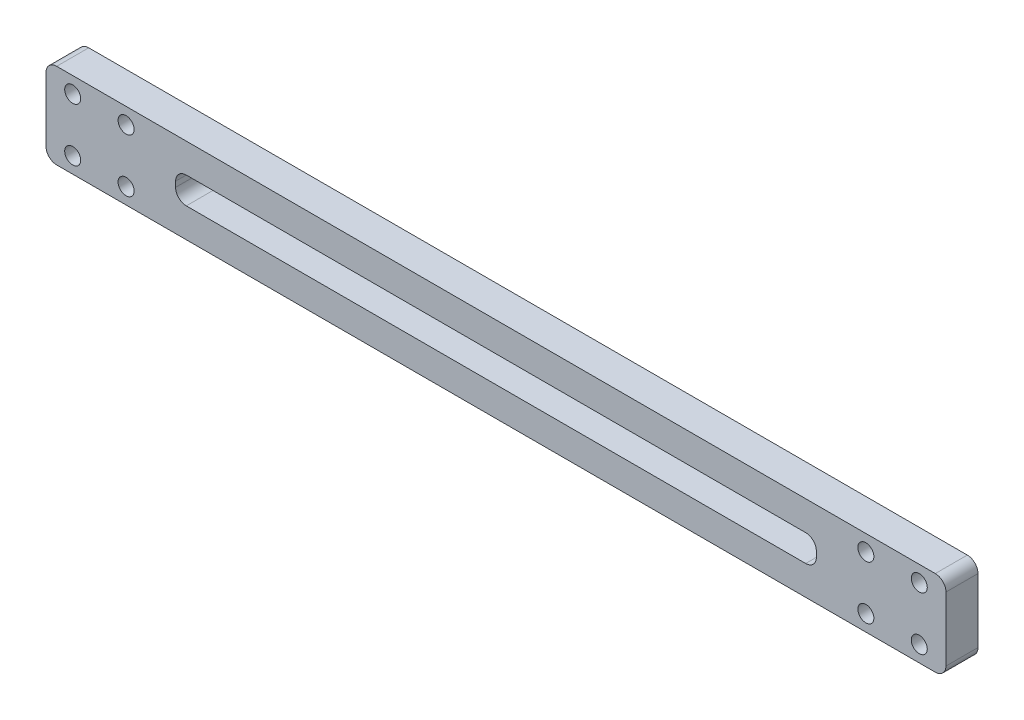
ISO-10303-21;
HEADER;
FILE_DESCRIPTION(('STEP AP214'),'2;1');
FILE_NAME('part.step','',(''),(''),'','','');
FILE_SCHEMA(('AUTOMOTIVE_DESIGN { 1 0 10303 214 1 1 1 1 }'));
ENDSEC;
DATA;
#1=APPLICATION_CONTEXT('core data for automotive mechanical design processes');
#2=APPLICATION_PROTOCOL_DEFINITION('international standard','automotive_design',2000,#1);
#3=PRODUCT_CONTEXT('',#1,'mechanical');
#4=PRODUCT('Part','Part','',(#3));
#5=PRODUCT_RELATED_PRODUCT_CATEGORY('part','',(#4));
#6=PRODUCT_DEFINITION_FORMATION('','',#4);
#7=PRODUCT_DEFINITION_CONTEXT('part definition',#1,'design');
#8=PRODUCT_DEFINITION('design','',#6,#7);
#9=PRODUCT_DEFINITION_SHAPE('','',#8);
#10=(LENGTH_UNIT() NAMED_UNIT(*) SI_UNIT(.MILLI.,.METRE.));
#11=(NAMED_UNIT(*) PLANE_ANGLE_UNIT() SI_UNIT($,.RADIAN.));
#12=(NAMED_UNIT(*) SI_UNIT($,.STERADIAN.) SOLID_ANGLE_UNIT());
#13=UNCERTAINTY_MEASURE_WITH_UNIT(LENGTH_MEASURE(1.E-05),#10,'distance_accuracy_value','');
#14=(GEOMETRIC_REPRESENTATION_CONTEXT(3) GLOBAL_UNCERTAINTY_ASSIGNED_CONTEXT((#13)) GLOBAL_UNIT_ASSIGNED_CONTEXT((#10,
#11,#12)) REPRESENTATION_CONTEXT('',''));
#15=CARTESIAN_POINT('',(0.,0.,0.));
#16=DIRECTION('',(0.,0.,1.));
#17=DIRECTION('',(1.,0.,0.));
#18=AXIS2_PLACEMENT_3D('',#15,#16,#17);
#19=CARTESIAN_POINT('',(0.,0.,6.));
#20=DIRECTION('',(0.,0.,-1.));
#21=DIRECTION('',(-1.,0.,0.));
#22=AXIS2_PLACEMENT_3D('',#19,#20,#21);
#23=PLANE('',#22);
#24=DIRECTION('',(-1.,0.,0.));
#25=VECTOR('',#24,1.);
#26=CARTESIAN_POINT('',(-60.,2.5,6.));
#27=LINE('',#26,#25);
#28=CARTESIAN_POINT('',(58.,2.5,6.));
#29=VERTEX_POINT('',#28);
#30=CARTESIAN_POINT('',(-58.,2.5,6.));
#31=VERTEX_POINT('',#30);
#32=EDGE_CURVE('E261',#29,#31,#27,.T.);
#33=ORIENTED_EDGE('',*,*,#32,.F.);
#34=CARTESIAN_POINT('',(58.,0.5,6.));
#35=DIRECTION('',(0.,0.,-1.));
#36=DIRECTION('',(-1.,0.,0.));
#37=AXIS2_PLACEMENT_3D('',#34,#35,#36);
#38=CIRCLE('',#37,2.);
#39=CARTESIAN_POINT('',(60.,0.5,6.));
#40=VERTEX_POINT('',#39);
#41=EDGE_CURVE('E255',#29,#40,#38,.T.);
#42=ORIENTED_EDGE('',*,*,#41,.T.);
#43=DIRECTION('',(0.,1.,0.));
#44=VECTOR('',#43,1.);
#45=CARTESIAN_POINT('',(60.,-2.5,6.));
#46=LINE('',#45,#44);
#47=CARTESIAN_POINT('',(60.,-0.5,6.));
#48=VERTEX_POINT('',#47);
#49=EDGE_CURVE('E268',#48,#40,#46,.T.);
#50=ORIENTED_EDGE('',*,*,#49,.F.);
#51=CARTESIAN_POINT('',(58.,-0.5,6.));
#52=DIRECTION('',(0.,0.,-1.));
#53=DIRECTION('',(-1.,0.,0.));
#54=AXIS2_PLACEMENT_3D('',#51,#52,#53);
#55=CIRCLE('',#54,2.);
#56=CARTESIAN_POINT('',(58.,-2.5,6.));
#57=VERTEX_POINT('',#56);
#58=EDGE_CURVE('E247',#48,#57,#55,.T.);
#59=ORIENTED_EDGE('',*,*,#58,.T.);
#60=DIRECTION('',(1.,0.,0.));
#61=VECTOR('',#60,1.);
#62=CARTESIAN_POINT('',(-60.,-2.5,6.));
#63=LINE('',#62,#61);
#64=CARTESIAN_POINT('',(-58.,-2.5,6.));
#65=VERTEX_POINT('',#64);
#66=EDGE_CURVE('E292',#65,#57,#63,.T.);
#67=ORIENTED_EDGE('',*,*,#66,.F.);
#68=CARTESIAN_POINT('',(-58.,-0.5,6.));
#69=DIRECTION('',(0.,0.,-1.));
#70=DIRECTION('',(-1.,0.,0.));
#71=AXIS2_PLACEMENT_3D('',#68,#69,#70);
#72=CIRCLE('',#71,2.);
#73=CARTESIAN_POINT('',(-60.,-0.5,6.));
#74=VERTEX_POINT('',#73);
#75=EDGE_CURVE('E251',#65,#74,#72,.T.);
#76=ORIENTED_EDGE('',*,*,#75,.T.);
#77=DIRECTION('',(0.,-1.,0.));
#78=VECTOR('',#77,1.);
#79=CARTESIAN_POINT('',(-60.,-2.5,6.));
#80=LINE('',#79,#78);
#81=CARTESIAN_POINT('',(-60.,0.5,6.));
#82=VERTEX_POINT('',#81);
#83=EDGE_CURVE('E263',#82,#74,#80,.T.);
#84=ORIENTED_EDGE('',*,*,#83,.F.);
#85=CARTESIAN_POINT('',(-58.,0.5,6.));
#86=DIRECTION('',(0.,0.,-1.));
#87=DIRECTION('',(-1.,0.,0.));
#88=AXIS2_PLACEMENT_3D('',#85,#86,#87);
#89=CIRCLE('',#88,2.);
#90=EDGE_CURVE('E52',#82,#31,#89,.T.);
#91=ORIENTED_EDGE('',*,*,#90,.T.);
#92=EDGE_LOOP('',(#33,#42,#50,#59,#67,#76,#84,#91));
#93=FACE_BOUND('',#92,.T.);
#94=DIRECTION('',(1.,0.,0.));
#95=VECTOR('',#94,1.);
#96=CARTESIAN_POINT('',(-84.27,-8.,6.));
#97=LINE('',#96,#95);
#98=CARTESIAN_POINT('',(-82.27,-8.,6.));
#99=VERTEX_POINT('',#98);
#100=CARTESIAN_POINT('',(82.27,-8.,6.));
#101=VERTEX_POINT('',#100);
#102=EDGE_CURVE('E195',#99,#101,#97,.T.);
#103=ORIENTED_EDGE('',*,*,#102,.T.);
#104=CARTESIAN_POINT('',(82.27,-6.,6.));
#105=DIRECTION('',(0.,0.,-1.));
#106=DIRECTION('',(-1.,0.,0.));
#107=AXIS2_PLACEMENT_3D('',#104,#105,#106);
#108=CIRCLE('',#107,2.);
#109=CARTESIAN_POINT('',(84.27,-6.,6.));
#110=VERTEX_POINT('',#109);
#111=EDGE_CURVE('E216',#101,#110,#108,.F.);
#112=ORIENTED_EDGE('',*,*,#111,.T.);
#113=DIRECTION('',(0.,1.,0.));
#114=VECTOR('',#113,1.);
#115=CARTESIAN_POINT('',(84.27,-8.,6.));
#116=LINE('',#115,#114);
#117=CARTESIAN_POINT('',(84.27,6.,6.));
#118=VERTEX_POINT('',#117);
#119=EDGE_CURVE('E178',#110,#118,#116,.T.);
#120=ORIENTED_EDGE('',*,*,#119,.T.);
#121=CARTESIAN_POINT('',(82.27,6.,6.));
#122=DIRECTION('',(0.,0.,-1.));
#123=DIRECTION('',(-1.,0.,0.));
#124=AXIS2_PLACEMENT_3D('',#121,#122,#123);
#125=CIRCLE('',#124,2.);
#126=CARTESIAN_POINT('',(82.27,8.,6.));
#127=VERTEX_POINT('',#126);
#128=EDGE_CURVE('E210',#118,#127,#125,.F.);
#129=ORIENTED_EDGE('',*,*,#128,.T.);
#130=DIRECTION('',(-1.,0.,0.));
#131=VECTOR('',#130,1.);
#132=CARTESIAN_POINT('',(-84.27,8.,6.));
#133=LINE('',#132,#131);
#134=CARTESIAN_POINT('',(-82.27,8.,6.));
#135=VERTEX_POINT('',#134);
#136=EDGE_CURVE('E339',#127,#135,#133,.T.);
#137=ORIENTED_EDGE('',*,*,#136,.T.);
#138=CARTESIAN_POINT('',(-82.27,6.,6.));
#139=DIRECTION('',(0.,0.,-1.));
#140=DIRECTION('',(-1.,0.,0.));
#141=AXIS2_PLACEMENT_3D('',#138,#139,#140);
#142=CIRCLE('',#141,2.);
#143=CARTESIAN_POINT('',(-84.27,6.,6.));
#144=VERTEX_POINT('',#143);
#145=EDGE_CURVE('E212',#135,#144,#142,.F.);
#146=ORIENTED_EDGE('',*,*,#145,.T.);
#147=DIRECTION('',(0.,-1.,0.));
#148=VECTOR('',#147,1.);
#149=CARTESIAN_POINT('',(-84.27,-8.,6.));
#150=LINE('',#149,#148);
#151=CARTESIAN_POINT('',(-84.27,-6.,6.));
#152=VERTEX_POINT('',#151);
#153=EDGE_CURVE('E341',#144,#152,#150,.T.);
#154=ORIENTED_EDGE('',*,*,#153,.T.);
#155=CARTESIAN_POINT('',(-82.27,-6.,6.));
#156=DIRECTION('',(0.,0.,-1.));
#157=DIRECTION('',(-1.,0.,0.));
#158=AXIS2_PLACEMENT_3D('',#155,#156,#157);
#159=CIRCLE('',#158,2.);
#160=EDGE_CURVE('E214',#152,#99,#159,.F.);
#161=ORIENTED_EDGE('',*,*,#160,.T.);
#162=EDGE_LOOP('',(#103,#112,#120,#129,#137,#146,#154,#161));
#163=FACE_BOUND('',#162,.T.);
#164=CARTESIAN_POINT('',(69.27,5.,6.));
#165=DIRECTION('',(0.,0.,1.));
#166=DIRECTION('',(1.,0.,0.));
#167=AXIS2_PLACEMENT_3D('',#164,#165,#166);
#168=CIRCLE('',#167,1.5);
#169=CARTESIAN_POINT('',(70.77,5.,6.));
#170=VERTEX_POINT('',#169);
#171=EDGE_CURVE('E186',#170,#170,#168,.T.);
#172=ORIENTED_EDGE('',*,*,#171,.F.);
#173=EDGE_LOOP('',(#172));
#174=FACE_BOUND('',#173,.T.);
#175=CARTESIAN_POINT('',(79.27,5.,6.));
#176=DIRECTION('',(0.,0.,1.));
#177=DIRECTION('',(1.,0.,0.));
#178=AXIS2_PLACEMENT_3D('',#175,#176,#177);
#179=CIRCLE('',#178,1.5);
#180=CARTESIAN_POINT('',(80.77,5.,6.));
#181=VERTEX_POINT('',#180);
#182=EDGE_CURVE('E331',#181,#181,#179,.T.);
#183=ORIENTED_EDGE('',*,*,#182,.F.);
#184=EDGE_LOOP('',(#183));
#185=FACE_BOUND('',#184,.T.);
#186=CARTESIAN_POINT('',(69.27,-5.,6.));
#187=DIRECTION('',(0.,0.,1.));
#188=DIRECTION('',(1.,0.,0.));
#189=AXIS2_PLACEMENT_3D('',#186,#187,#188);
#190=CIRCLE('',#189,1.5);
#191=CARTESIAN_POINT('',(70.77,-5.,6.));
#192=VERTEX_POINT('',#191);
#193=EDGE_CURVE('E325',#192,#192,#190,.T.);
#194=ORIENTED_EDGE('',*,*,#193,.F.);
#195=EDGE_LOOP('',(#194));
#196=FACE_BOUND('',#195,.T.);
#197=CARTESIAN_POINT('',(79.27,-5.,6.));
#198=DIRECTION('',(0.,0.,1.));
#199=DIRECTION('',(1.,0.,0.));
#200=AXIS2_PLACEMENT_3D('',#197,#198,#199);
#201=CIRCLE('',#200,1.5);
#202=CARTESIAN_POINT('',(80.77,-5.,6.));
#203=VERTEX_POINT('',#202);
#204=EDGE_CURVE('E319',#203,#203,#201,.T.);
#205=ORIENTED_EDGE('',*,*,#204,.F.);
#206=EDGE_LOOP('',(#205));
#207=FACE_BOUND('',#206,.T.);
#208=CARTESIAN_POINT('',(-79.27,-5.,6.));
#209=DIRECTION('',(0.,0.,1.));
#210=DIRECTION('',(-1.,0.,0.));
#211=AXIS2_PLACEMENT_3D('',#208,#209,#210);
#212=CIRCLE('',#211,1.5);
#213=CARTESIAN_POINT('',(-80.77,-5.,6.));
#214=VERTEX_POINT('',#213);
#215=EDGE_CURVE('E313',#214,#214,#212,.T.);
#216=ORIENTED_EDGE('',*,*,#215,.F.);
#217=EDGE_LOOP('',(#216));
#218=FACE_BOUND('',#217,.T.);
#219=CARTESIAN_POINT('',(-69.27,-5.,6.));
#220=DIRECTION('',(0.,0.,1.));
#221=DIRECTION('',(-1.,0.,0.));
#222=AXIS2_PLACEMENT_3D('',#219,#220,#221);
#223=CIRCLE('',#222,1.5);
#224=CARTESIAN_POINT('',(-70.77,-5.,6.));
#225=VERTEX_POINT('',#224);
#226=EDGE_CURVE('E307',#225,#225,#223,.T.);
#227=ORIENTED_EDGE('',*,*,#226,.F.);
#228=EDGE_LOOP('',(#227));
#229=FACE_BOUND('',#228,.T.);
#230=CARTESIAN_POINT('',(-69.27,5.,6.));
#231=DIRECTION('',(0.,0.,1.));
#232=DIRECTION('',(-1.,0.,0.));
#233=AXIS2_PLACEMENT_3D('',#230,#231,#232);
#234=CIRCLE('',#233,1.5);
#235=CARTESIAN_POINT('',(-70.77,5.,6.));
#236=VERTEX_POINT('',#235);
#237=EDGE_CURVE('E301',#236,#236,#234,.T.);
#238=ORIENTED_EDGE('',*,*,#237,.F.);
#239=EDGE_LOOP('',(#238));
#240=FACE_BOUND('',#239,.T.);
#241=CARTESIAN_POINT('',(-79.27,5.,6.));
#242=DIRECTION('',(0.,0.,1.));
#243=DIRECTION('',(-1.,0.,0.));
#244=AXIS2_PLACEMENT_3D('',#241,#242,#243);
#245=CIRCLE('',#244,1.5);
#246=CARTESIAN_POINT('',(-80.77,5.,6.));
#247=VERTEX_POINT('',#246);
#248=EDGE_CURVE('E295',#247,#247,#245,.T.);
#249=ORIENTED_EDGE('',*,*,#248,.F.);
#250=EDGE_LOOP('',(#249));
#251=FACE_BOUND('',#250,.T.);
#252=ADVANCED_FACE('F44',(#93,#163,#174,#185,#196,#207,#218,#229,#240,#251),#23,.F.);
#253=CARTESIAN_POINT('',(0.,0.,0.));
#254=DIRECTION('',(0.,0.,-1.));
#255=DIRECTION('',(-1.,0.,0.));
#256=AXIS2_PLACEMENT_3D('',#253,#254,#255);
#257=PLANE('',#256);
#258=DIRECTION('',(1.,0.,0.));
#259=VECTOR('',#258,1.);
#260=CARTESIAN_POINT('',(-60.,-2.5,0.));
#261=LINE('',#260,#259);
#262=CARTESIAN_POINT('',(-58.,-2.5,0.));
#263=VERTEX_POINT('',#262);
#264=CARTESIAN_POINT('',(58.,-2.5,0.));
#265=VERTEX_POINT('',#264);
#266=EDGE_CURVE('E281',#263,#265,#261,.T.);
#267=ORIENTED_EDGE('',*,*,#266,.T.);
#268=CARTESIAN_POINT('',(58.,-0.5,0.));
#269=DIRECTION('',(0.,0.,-1.));
#270=DIRECTION('',(-1.,0.,0.));
#271=AXIS2_PLACEMENT_3D('',#268,#269,#270);
#272=CIRCLE('',#271,2.);
#273=CARTESIAN_POINT('',(60.,-0.5,0.));
#274=VERTEX_POINT('',#273);
#275=EDGE_CURVE('E249',#265,#274,#272,.F.);
#276=ORIENTED_EDGE('',*,*,#275,.T.);
#277=DIRECTION('',(0.,1.,0.));
#278=VECTOR('',#277,1.);
#279=CARTESIAN_POINT('',(60.,-2.5,0.));
#280=LINE('',#279,#278);
#281=CARTESIAN_POINT('',(60.,0.5,0.));
#282=VERTEX_POINT('',#281);
#283=EDGE_CURVE('E285',#274,#282,#280,.T.);
#284=ORIENTED_EDGE('',*,*,#283,.T.);
#285=CARTESIAN_POINT('',(58.,0.5,0.));
#286=DIRECTION('',(0.,0.,-1.));
#287=DIRECTION('',(-1.,0.,0.));
#288=AXIS2_PLACEMENT_3D('',#285,#286,#287);
#289=CIRCLE('',#288,2.);
#290=CARTESIAN_POINT('',(58.,2.5,0.));
#291=VERTEX_POINT('',#290);
#292=EDGE_CURVE('E66',#282,#291,#289,.F.);
#293=ORIENTED_EDGE('',*,*,#292,.T.);
#294=DIRECTION('',(-1.,0.,0.));
#295=VECTOR('',#294,1.);
#296=CARTESIAN_POINT('',(-60.,2.5,0.));
#297=LINE('',#296,#295);
#298=CARTESIAN_POINT('',(-58.,2.5,0.));
#299=VERTEX_POINT('',#298);
#300=EDGE_CURVE('E277',#291,#299,#297,.T.);
#301=ORIENTED_EDGE('',*,*,#300,.T.);
#302=CARTESIAN_POINT('',(-58.,0.5,0.));
#303=DIRECTION('',(0.,0.,-1.));
#304=DIRECTION('',(-1.,0.,0.));
#305=AXIS2_PLACEMENT_3D('',#302,#303,#304);
#306=CIRCLE('',#305,2.);
#307=CARTESIAN_POINT('',(-60.,0.5,0.));
#308=VERTEX_POINT('',#307);
#309=EDGE_CURVE('E11',#299,#308,#306,.F.);
#310=ORIENTED_EDGE('',*,*,#309,.T.);
#311=DIRECTION('',(0.,-1.,0.));
#312=VECTOR('',#311,1.);
#313=CARTESIAN_POINT('',(-60.,-2.5,0.));
#314=LINE('',#313,#312);
#315=CARTESIAN_POINT('',(-60.,-0.5,0.));
#316=VERTEX_POINT('',#315);
#317=EDGE_CURVE('E275',#308,#316,#314,.T.);
#318=ORIENTED_EDGE('',*,*,#317,.T.);
#319=CARTESIAN_POINT('',(-58.,-0.5,0.));
#320=DIRECTION('',(0.,0.,-1.));
#321=DIRECTION('',(-1.,0.,0.));
#322=AXIS2_PLACEMENT_3D('',#319,#320,#321);
#323=CIRCLE('',#322,2.);
#324=EDGE_CURVE('E253',#316,#263,#323,.F.);
#325=ORIENTED_EDGE('',*,*,#324,.T.);
#326=EDGE_LOOP('',(#267,#276,#284,#293,#301,#310,#318,#325));
#327=FACE_BOUND('',#326,.T.);
#328=CARTESIAN_POINT('',(-69.27,5.,0.));
#329=DIRECTION('',(0.,0.,1.));
#330=DIRECTION('',(-1.,0.,0.));
#331=AXIS2_PLACEMENT_3D('',#328,#329,#330);
#332=CIRCLE('',#331,1.5);
#333=CARTESIAN_POINT('',(-70.77,5.,0.));
#334=VERTEX_POINT('',#333);
#335=EDGE_CURVE('E298',#334,#334,#332,.T.);
#336=ORIENTED_EDGE('',*,*,#335,.T.);
#337=EDGE_LOOP('',(#336));
#338=FACE_BOUND('',#337,.T.);
#339=CARTESIAN_POINT('',(-79.27,-5.,0.));
#340=DIRECTION('',(0.,0.,1.));
#341=DIRECTION('',(-1.,0.,0.));
#342=AXIS2_PLACEMENT_3D('',#339,#340,#341);
#343=CIRCLE('',#342,1.5);
#344=CARTESIAN_POINT('',(-80.77,-5.,0.));
#345=VERTEX_POINT('',#344);
#346=EDGE_CURVE('E310',#345,#345,#343,.T.);
#347=ORIENTED_EDGE('',*,*,#346,.T.);
#348=EDGE_LOOP('',(#347));
#349=FACE_BOUND('',#348,.T.);
#350=CARTESIAN_POINT('',(69.27,-5.,0.));
#351=DIRECTION('',(0.,0.,1.));
#352=DIRECTION('',(1.,0.,0.));
#353=AXIS2_PLACEMENT_3D('',#350,#351,#352);
#354=CIRCLE('',#353,1.5);
#355=CARTESIAN_POINT('',(70.77,-5.,0.));
#356=VERTEX_POINT('',#355);
#357=EDGE_CURVE('E322',#356,#356,#354,.T.);
#358=ORIENTED_EDGE('',*,*,#357,.T.);
#359=EDGE_LOOP('',(#358));
#360=FACE_BOUND('',#359,.T.);
#361=CARTESIAN_POINT('',(69.27,5.,0.));
#362=DIRECTION('',(0.,0.,1.));
#363=DIRECTION('',(1.,0.,0.));
#364=AXIS2_PLACEMENT_3D('',#361,#362,#363);
#365=CIRCLE('',#364,1.5);
#366=CARTESIAN_POINT('',(70.77,5.,0.));
#367=VERTEX_POINT('',#366);
#368=EDGE_CURVE('E192',#367,#367,#365,.T.);
#369=ORIENTED_EDGE('',*,*,#368,.T.);
#370=EDGE_LOOP('',(#369));
#371=FACE_BOUND('',#370,.T.);
#372=DIRECTION('',(0.,1.,0.));
#373=VECTOR('',#372,1.);
#374=CARTESIAN_POINT('',(84.27,-8.,0.));
#375=LINE('',#374,#373);
#376=CARTESIAN_POINT('',(84.27,-6.,0.));
#377=VERTEX_POINT('',#376);
#378=CARTESIAN_POINT('',(84.27,6.,0.));
#379=VERTEX_POINT('',#378);
#380=EDGE_CURVE('E175',#377,#379,#375,.T.);
#381=ORIENTED_EDGE('',*,*,#380,.F.);
#382=CARTESIAN_POINT('',(82.27,-6.,0.));
#383=DIRECTION('',(0.,0.,-1.));
#384=DIRECTION('',(-1.,0.,0.));
#385=AXIS2_PLACEMENT_3D('',#382,#383,#384);
#386=CIRCLE('',#385,2.);
#387=CARTESIAN_POINT('',(82.27,-8.,0.));
#388=VERTEX_POINT('',#387);
#389=EDGE_CURVE('E158',#377,#388,#386,.T.);
#390=ORIENTED_EDGE('',*,*,#389,.T.);
#391=DIRECTION('',(1.,0.,0.));
#392=VECTOR('',#391,1.);
#393=CARTESIAN_POINT('',(-84.27,-8.,0.));
#394=LINE('',#393,#392);
#395=CARTESIAN_POINT('',(-82.27,-8.,0.));
#396=VERTEX_POINT('',#395);
#397=EDGE_CURVE('E200',#396,#388,#394,.T.);
#398=ORIENTED_EDGE('',*,*,#397,.F.);
#399=CARTESIAN_POINT('',(-82.27,-6.,0.));
#400=DIRECTION('',(0.,0.,-1.));
#401=DIRECTION('',(-1.,0.,0.));
#402=AXIS2_PLACEMENT_3D('',#399,#400,#401);
#403=CIRCLE('',#402,2.);
#404=CARTESIAN_POINT('',(-84.27,-6.,0.));
#405=VERTEX_POINT('',#404);
#406=EDGE_CURVE('E169',#396,#405,#403,.T.);
#407=ORIENTED_EDGE('',*,*,#406,.T.);
#408=DIRECTION('',(0.,-1.,0.));
#409=VECTOR('',#408,1.);
#410=CARTESIAN_POINT('',(-84.27,-8.,0.));
#411=LINE('',#410,#409);
#412=CARTESIAN_POINT('',(-84.27,6.,0.));
#413=VERTEX_POINT('',#412);
#414=EDGE_CURVE('E189',#413,#405,#411,.T.);
#415=ORIENTED_EDGE('',*,*,#414,.F.);
#416=CARTESIAN_POINT('',(-82.27,6.,0.));
#417=DIRECTION('',(0.,0.,-1.));
#418=DIRECTION('',(-1.,0.,0.));
#419=AXIS2_PLACEMENT_3D('',#416,#417,#418);
#420=CIRCLE('',#419,2.);
#421=CARTESIAN_POINT('',(-82.27,8.,0.));
#422=VERTEX_POINT('',#421);
#423=EDGE_CURVE('E204',#413,#422,#420,.T.);
#424=ORIENTED_EDGE('',*,*,#423,.T.);
#425=DIRECTION('',(-1.,0.,0.));
#426=VECTOR('',#425,1.);
#427=CARTESIAN_POINT('',(-84.27,8.,0.));
#428=LINE('',#427,#426);
#429=CARTESIAN_POINT('',(82.27,8.,0.));
#430=VERTEX_POINT('',#429);
#431=EDGE_CURVE('E185',#430,#422,#428,.T.);
#432=ORIENTED_EDGE('',*,*,#431,.F.);
#433=CARTESIAN_POINT('',(82.27,6.,0.));
#434=DIRECTION('',(0.,0.,-1.));
#435=DIRECTION('',(-1.,0.,0.));
#436=AXIS2_PLACEMENT_3D('',#433,#434,#435);
#437=CIRCLE('',#436,2.);
#438=EDGE_CURVE('E179',#430,#379,#437,.T.);
#439=ORIENTED_EDGE('',*,*,#438,.T.);
#440=EDGE_LOOP('',(#381,#390,#398,#407,#415,#424,#432,#439));
#441=FACE_BOUND('',#440,.T.);
#442=CARTESIAN_POINT('',(79.27,5.,0.));
#443=DIRECTION('',(0.,0.,1.));
#444=DIRECTION('',(1.,0.,0.));
#445=AXIS2_PLACEMENT_3D('',#442,#443,#444);
#446=CIRCLE('',#445,1.5);
#447=CARTESIAN_POINT('',(80.77,5.,0.));
#448=VERTEX_POINT('',#447);
#449=EDGE_CURVE('E328',#448,#448,#446,.T.);
#450=ORIENTED_EDGE('',*,*,#449,.T.);
#451=EDGE_LOOP('',(#450));
#452=FACE_BOUND('',#451,.T.);
#453=CARTESIAN_POINT('',(79.27,-5.,0.));
#454=DIRECTION('',(0.,0.,1.));
#455=DIRECTION('',(1.,0.,0.));
#456=AXIS2_PLACEMENT_3D('',#453,#454,#455);
#457=CIRCLE('',#456,1.5);
#458=CARTESIAN_POINT('',(80.77,-5.,0.));
#459=VERTEX_POINT('',#458);
#460=EDGE_CURVE('E316',#459,#459,#457,.T.);
#461=ORIENTED_EDGE('',*,*,#460,.T.);
#462=EDGE_LOOP('',(#461));
#463=FACE_BOUND('',#462,.T.);
#464=CARTESIAN_POINT('',(-69.27,-5.,0.));
#465=DIRECTION('',(0.,0.,1.));
#466=DIRECTION('',(-1.,0.,0.));
#467=AXIS2_PLACEMENT_3D('',#464,#465,#466);
#468=CIRCLE('',#467,1.5);
#469=CARTESIAN_POINT('',(-70.77,-5.,0.));
#470=VERTEX_POINT('',#469);
#471=EDGE_CURVE('E304',#470,#470,#468,.T.);
#472=ORIENTED_EDGE('',*,*,#471,.T.);
#473=EDGE_LOOP('',(#472));
#474=FACE_BOUND('',#473,.T.);
#475=CARTESIAN_POINT('',(-79.27,5.,0.));
#476=DIRECTION('',(0.,0.,1.));
#477=DIRECTION('',(-1.,0.,0.));
#478=AXIS2_PLACEMENT_3D('',#475,#476,#477);
#479=CIRCLE('',#478,1.5);
#480=CARTESIAN_POINT('',(-80.77,5.,0.));
#481=VERTEX_POINT('',#480);
#482=EDGE_CURVE('E283',#481,#481,#479,.T.);
#483=ORIENTED_EDGE('',*,*,#482,.T.);
#484=EDGE_LOOP('',(#483));
#485=FACE_BOUND('',#484,.T.);
#486=ADVANCED_FACE('F182',(#327,#338,#349,#360,#371,#441,#452,#463,#474,#485),#257,.T.);
#487=CARTESIAN_POINT('',(84.27,-8.,6.));
#488=DIRECTION('',(-1.,0.,0.));
#489=DIRECTION('',(0.,0.,1.));
#490=AXIS2_PLACEMENT_3D('',#487,#488,#489);
#491=PLANE('',#490);
#492=ORIENTED_EDGE('',*,*,#119,.F.);
#493=DIRECTION('',(0.,0.,-1.));
#494=VECTOR('',#493,1.);
#495=CARTESIAN_POINT('',(84.27,-6.,6.));
#496=LINE('',#495,#494);
#497=EDGE_CURVE('E162',#110,#377,#496,.T.);
#498=ORIENTED_EDGE('',*,*,#497,.T.);
#499=ORIENTED_EDGE('',*,*,#380,.T.);
#500=DIRECTION('',(0.,0.,-1.));
#501=VECTOR('',#500,1.);
#502=CARTESIAN_POINT('',(84.27,6.,6.));
#503=LINE('',#502,#501);
#504=EDGE_CURVE('E180',#379,#118,#503,.F.);
#505=ORIENTED_EDGE('',*,*,#504,.T.);
#506=EDGE_LOOP('',(#492,#498,#499,#505));
#507=FACE_BOUND('',#506,.T.);
#508=ADVANCED_FACE('F174',(#507),#491,.F.);
#509=CARTESIAN_POINT('',(-84.27,8.,6.));
#510=DIRECTION('',(0.,-1.,0.));
#511=DIRECTION('',(0.,0.,-1.));
#512=AXIS2_PLACEMENT_3D('',#509,#510,#511);
#513=PLANE('',#512);
#514=ORIENTED_EDGE('',*,*,#431,.T.);
#515=DIRECTION('',(0.,0.,-1.));
#516=VECTOR('',#515,1.);
#517=CARTESIAN_POINT('',(-82.27,8.,6.));
#518=LINE('',#517,#516);
#519=EDGE_CURVE('E226',#422,#135,#518,.F.);
#520=ORIENTED_EDGE('',*,*,#519,.T.);
#521=ORIENTED_EDGE('',*,*,#136,.F.);
#522=DIRECTION('',(0.,0.,-1.));
#523=VECTOR('',#522,1.);
#524=CARTESIAN_POINT('',(82.27,8.,6.));
#525=LINE('',#524,#523);
#526=EDGE_CURVE('E223',#127,#430,#525,.T.);
#527=ORIENTED_EDGE('',*,*,#526,.T.);
#528=EDGE_LOOP('',(#514,#520,#521,#527));
#529=FACE_BOUND('',#528,.T.);
#530=ADVANCED_FACE('F363',(#529),#513,.F.);
#531=CARTESIAN_POINT('',(-84.27,-8.,6.));
#532=DIRECTION('',(1.,0.,0.));
#533=DIRECTION('',(0.,0.,-1.));
#534=AXIS2_PLACEMENT_3D('',#531,#532,#533);
#535=PLANE('',#534);
#536=ORIENTED_EDGE('',*,*,#414,.T.);
#537=DIRECTION('',(0.,0.,-1.));
#538=VECTOR('',#537,1.);
#539=CARTESIAN_POINT('',(-84.27,-6.,6.));
#540=LINE('',#539,#538);
#541=EDGE_CURVE('E221',#405,#152,#540,.F.);
#542=ORIENTED_EDGE('',*,*,#541,.T.);
#543=ORIENTED_EDGE('',*,*,#153,.F.);
#544=DIRECTION('',(0.,0.,-1.));
#545=VECTOR('',#544,1.);
#546=CARTESIAN_POINT('',(-84.27,6.,6.));
#547=LINE('',#546,#545);
#548=EDGE_CURVE('E218',#144,#413,#547,.T.);
#549=ORIENTED_EDGE('',*,*,#548,.T.);
#550=EDGE_LOOP('',(#536,#542,#543,#549));
#551=FACE_BOUND('',#550,.T.);
#552=ADVANCED_FACE('F356',(#551),#535,.F.);
#553=CARTESIAN_POINT('',(-84.27,-8.,6.));
#554=DIRECTION('',(0.,1.,0.));
#555=DIRECTION('',(0.,0.,1.));
#556=AXIS2_PLACEMENT_3D('',#553,#554,#555);
#557=PLANE('',#556);
#558=ORIENTED_EDGE('',*,*,#397,.T.);
#559=DIRECTION('',(0.,0.,-1.));
#560=VECTOR('',#559,1.);
#561=CARTESIAN_POINT('',(82.27,-8.,6.));
#562=LINE('',#561,#560);
#563=EDGE_CURVE('E163',#388,#101,#562,.F.);
#564=ORIENTED_EDGE('',*,*,#563,.T.);
#565=ORIENTED_EDGE('',*,*,#102,.F.);
#566=DIRECTION('',(0.,0.,-1.));
#567=VECTOR('',#566,1.);
#568=CARTESIAN_POINT('',(-82.27,-8.,6.));
#569=LINE('',#568,#567);
#570=EDGE_CURVE('E168',#99,#396,#569,.T.);
#571=ORIENTED_EDGE('',*,*,#570,.T.);
#572=EDGE_LOOP('',(#558,#564,#565,#571));
#573=FACE_BOUND('',#572,.T.);
#574=ADVANCED_FACE('F350',(#573),#557,.F.);
#575=CARTESIAN_POINT('',(69.27,5.,6.));
#576=DIRECTION('',(0.,0.,-1.));
#577=DIRECTION('',(-1.,0.,0.));
#578=AXIS2_PLACEMENT_3D('',#575,#576,#577);
#579=CYLINDRICAL_SURFACE('',#578,1.5);
#580=ORIENTED_EDGE('',*,*,#171,.T.);
#581=EDGE_LOOP('',(#580));
#582=FACE_BOUND('',#581,.T.);
#583=ORIENTED_EDGE('',*,*,#368,.F.);
#584=EDGE_LOOP('',(#583));
#585=FACE_BOUND('',#584,.T.);
#586=ADVANCED_FACE('F388',(#582,#585),#579,.F.);
#587=CARTESIAN_POINT('',(79.27,5.,6.));
#588=DIRECTION('',(0.,0.,-1.));
#589=DIRECTION('',(-1.,0.,0.));
#590=AXIS2_PLACEMENT_3D('',#587,#588,#589);
#591=CYLINDRICAL_SURFACE('',#590,1.5);
#592=ORIENTED_EDGE('',*,*,#182,.T.);
#593=EDGE_LOOP('',(#592));
#594=FACE_BOUND('',#593,.T.);
#595=ORIENTED_EDGE('',*,*,#449,.F.);
#596=EDGE_LOOP('',(#595));
#597=FACE_BOUND('',#596,.T.);
#598=ADVANCED_FACE('F582',(#594,#597),#591,.F.);
#599=CARTESIAN_POINT('',(69.27,-5.,6.));
#600=DIRECTION('',(0.,0.,-1.));
#601=DIRECTION('',(-1.,0.,0.));
#602=AXIS2_PLACEMENT_3D('',#599,#600,#601);
#603=CYLINDRICAL_SURFACE('',#602,1.5);
#604=ORIENTED_EDGE('',*,*,#193,.T.);
#605=EDGE_LOOP('',(#604));
#606=FACE_BOUND('',#605,.T.);
#607=ORIENTED_EDGE('',*,*,#357,.F.);
#608=EDGE_LOOP('',(#607));
#609=FACE_BOUND('',#608,.T.);
#610=ADVANCED_FACE('F572',(#606,#609),#603,.F.);
#611=CARTESIAN_POINT('',(79.27,-5.,6.));
#612=DIRECTION('',(0.,0.,-1.));
#613=DIRECTION('',(-1.,0.,0.));
#614=AXIS2_PLACEMENT_3D('',#611,#612,#613);
#615=CYLINDRICAL_SURFACE('',#614,1.5);
#616=ORIENTED_EDGE('',*,*,#204,.T.);
#617=EDGE_LOOP('',(#616));
#618=FACE_BOUND('',#617,.T.);
#619=ORIENTED_EDGE('',*,*,#460,.F.);
#620=EDGE_LOOP('',(#619));
#621=FACE_BOUND('',#620,.T.);
#622=ADVANCED_FACE('F562',(#618,#621),#615,.F.);
#623=CARTESIAN_POINT('',(-79.27,-5.,6.));
#624=DIRECTION('',(0.,0.,-1.));
#625=DIRECTION('',(-1.,0.,0.));
#626=AXIS2_PLACEMENT_3D('',#623,#624,#625);
#627=CYLINDRICAL_SURFACE('',#626,1.5);
#628=ORIENTED_EDGE('',*,*,#215,.T.);
#629=EDGE_LOOP('',(#628));
#630=FACE_BOUND('',#629,.T.);
#631=ORIENTED_EDGE('',*,*,#346,.F.);
#632=EDGE_LOOP('',(#631));
#633=FACE_BOUND('',#632,.T.);
#634=ADVANCED_FACE('F552',(#630,#633),#627,.F.);
#635=CARTESIAN_POINT('',(-69.27,-5.,6.));
#636=DIRECTION('',(0.,0.,-1.));
#637=DIRECTION('',(-1.,0.,0.));
#638=AXIS2_PLACEMENT_3D('',#635,#636,#637);
#639=CYLINDRICAL_SURFACE('',#638,1.5);
#640=ORIENTED_EDGE('',*,*,#226,.T.);
#641=EDGE_LOOP('',(#640));
#642=FACE_BOUND('',#641,.T.);
#643=ORIENTED_EDGE('',*,*,#471,.F.);
#644=EDGE_LOOP('',(#643));
#645=FACE_BOUND('',#644,.T.);
#646=ADVANCED_FACE('F542',(#642,#645),#639,.F.);
#647=CARTESIAN_POINT('',(-69.27,5.,6.));
#648=DIRECTION('',(0.,0.,-1.));
#649=DIRECTION('',(-1.,0.,0.));
#650=AXIS2_PLACEMENT_3D('',#647,#648,#649);
#651=CYLINDRICAL_SURFACE('',#650,1.5);
#652=ORIENTED_EDGE('',*,*,#237,.T.);
#653=EDGE_LOOP('',(#652));
#654=FACE_BOUND('',#653,.T.);
#655=ORIENTED_EDGE('',*,*,#335,.F.);
#656=EDGE_LOOP('',(#655));
#657=FACE_BOUND('',#656,.T.);
#658=ADVANCED_FACE('F532',(#654,#657),#651,.F.);
#659=CARTESIAN_POINT('',(-79.27,5.,6.));
#660=DIRECTION('',(0.,0.,-1.));
#661=DIRECTION('',(-1.,0.,0.));
#662=AXIS2_PLACEMENT_3D('',#659,#660,#661);
#663=CYLINDRICAL_SURFACE('',#662,1.5);
#664=ORIENTED_EDGE('',*,*,#248,.T.);
#665=EDGE_LOOP('',(#664));
#666=FACE_BOUND('',#665,.T.);
#667=ORIENTED_EDGE('',*,*,#482,.F.);
#668=EDGE_LOOP('',(#667));
#669=FACE_BOUND('',#668,.T.);
#670=ADVANCED_FACE('F401',(#666,#669),#663,.F.);
#671=CARTESIAN_POINT('',(82.27,-6.,6.));
#672=DIRECTION('',(0.,0.,-1.));
#673=DIRECTION('',(-1.,0.,0.));
#674=AXIS2_PLACEMENT_3D('',#671,#672,#673);
#675=CYLINDRICAL_SURFACE('',#674,2.);
#676=ORIENTED_EDGE('',*,*,#111,.F.);
#677=ORIENTED_EDGE('',*,*,#563,.F.);
#678=ORIENTED_EDGE('',*,*,#389,.F.);
#679=ORIENTED_EDGE('',*,*,#497,.F.);
#680=EDGE_LOOP('',(#676,#677,#678,#679));
#681=FACE_BOUND('',#680,.T.);
#682=ADVANCED_FACE('F161',(#681),#675,.T.);
#683=CARTESIAN_POINT('',(-82.27,-6.,6.));
#684=DIRECTION('',(0.,0.,-1.));
#685=DIRECTION('',(-1.,0.,0.));
#686=AXIS2_PLACEMENT_3D('',#683,#684,#685);
#687=CYLINDRICAL_SURFACE('',#686,2.);
#688=ORIENTED_EDGE('',*,*,#160,.F.);
#689=ORIENTED_EDGE('',*,*,#541,.F.);
#690=ORIENTED_EDGE('',*,*,#406,.F.);
#691=ORIENTED_EDGE('',*,*,#570,.F.);
#692=EDGE_LOOP('',(#688,#689,#690,#691));
#693=FACE_BOUND('',#692,.T.);
#694=ADVANCED_FACE('F352',(#693),#687,.T.);
#695=CARTESIAN_POINT('',(-82.27,6.,6.));
#696=DIRECTION('',(0.,0.,-1.));
#697=DIRECTION('',(-1.,0.,0.));
#698=AXIS2_PLACEMENT_3D('',#695,#696,#697);
#699=CYLINDRICAL_SURFACE('',#698,2.);
#700=ORIENTED_EDGE('',*,*,#145,.F.);
#701=ORIENTED_EDGE('',*,*,#519,.F.);
#702=ORIENTED_EDGE('',*,*,#423,.F.);
#703=ORIENTED_EDGE('',*,*,#548,.F.);
#704=EDGE_LOOP('',(#700,#701,#702,#703));
#705=FACE_BOUND('',#704,.T.);
#706=ADVANCED_FACE('F360',(#705),#699,.T.);
#707=CARTESIAN_POINT('',(82.27,6.,6.));
#708=DIRECTION('',(0.,0.,-1.));
#709=DIRECTION('',(-1.,0.,0.));
#710=AXIS2_PLACEMENT_3D('',#707,#708,#709);
#711=CYLINDRICAL_SURFACE('',#710,2.);
#712=ORIENTED_EDGE('',*,*,#128,.F.);
#713=ORIENTED_EDGE('',*,*,#504,.F.);
#714=ORIENTED_EDGE('',*,*,#438,.F.);
#715=ORIENTED_EDGE('',*,*,#526,.F.);
#716=EDGE_LOOP('',(#712,#713,#714,#715));
#717=FACE_BOUND('',#716,.T.);
#718=ADVANCED_FACE('F368',(#717),#711,.T.);
#719=CARTESIAN_POINT('',(60.,-2.5,0.));
#720=DIRECTION('',(1.,0.,0.));
#721=DIRECTION('',(0.,0.,-1.));
#722=AXIS2_PLACEMENT_3D('',#719,#720,#721);
#723=PLANE('',#722);
#724=ORIENTED_EDGE('',*,*,#283,.F.);
#725=DIRECTION('',(0.,0.,1.));
#726=VECTOR('',#725,1.);
#727=CARTESIAN_POINT('',(60.,-0.5,6.));
#728=LINE('',#727,#726);
#729=EDGE_CURVE('E230',#274,#48,#728,.T.);
#730=ORIENTED_EDGE('',*,*,#729,.T.);
#731=ORIENTED_EDGE('',*,*,#49,.T.);
#732=DIRECTION('',(0.,0.,1.));
#733=VECTOR('',#732,1.);
#734=CARTESIAN_POINT('',(60.,0.5,0.));
#735=LINE('',#734,#733);
#736=EDGE_CURVE('E228',#40,#282,#735,.F.);
#737=ORIENTED_EDGE('',*,*,#736,.T.);
#738=EDGE_LOOP('',(#724,#730,#731,#737));
#739=FACE_BOUND('',#738,.T.);
#740=ADVANCED_FACE('F370',(#739),#723,.F.);
#741=CARTESIAN_POINT('',(-60.,-2.5,0.));
#742=DIRECTION('',(0.,-1.,0.));
#743=DIRECTION('',(0.,0.,-1.));
#744=AXIS2_PLACEMENT_3D('',#741,#742,#743);
#745=PLANE('',#744);
#746=ORIENTED_EDGE('',*,*,#66,.T.);
#747=DIRECTION('',(0.,0.,1.));
#748=VECTOR('',#747,1.);
#749=CARTESIAN_POINT('',(58.,-2.5,0.));
#750=LINE('',#749,#748);
#751=EDGE_CURVE('E236',#57,#265,#750,.F.);
#752=ORIENTED_EDGE('',*,*,#751,.T.);
#753=ORIENTED_EDGE('',*,*,#266,.F.);
#754=DIRECTION('',(0.,0.,1.));
#755=VECTOR('',#754,1.);
#756=CARTESIAN_POINT('',(-58.,-2.5,6.));
#757=LINE('',#756,#755);
#758=EDGE_CURVE('E233',#263,#65,#757,.T.);
#759=ORIENTED_EDGE('',*,*,#758,.T.);
#760=EDGE_LOOP('',(#746,#752,#753,#759));
#761=FACE_BOUND('',#760,.T.);
#762=ADVANCED_FACE('F376',(#761),#745,.F.);
#763=CARTESIAN_POINT('',(-60.,-2.5,0.));
#764=DIRECTION('',(-1.,0.,0.));
#765=DIRECTION('',(0.,0.,1.));
#766=AXIS2_PLACEMENT_3D('',#763,#764,#765);
#767=PLANE('',#766);
#768=ORIENTED_EDGE('',*,*,#83,.T.);
#769=DIRECTION('',(0.,0.,1.));
#770=VECTOR('',#769,1.);
#771=CARTESIAN_POINT('',(-60.,-0.5,0.));
#772=LINE('',#771,#770);
#773=EDGE_CURVE('E241',#74,#316,#772,.F.);
#774=ORIENTED_EDGE('',*,*,#773,.T.);
#775=ORIENTED_EDGE('',*,*,#317,.F.);
#776=DIRECTION('',(0.,0.,1.));
#777=VECTOR('',#776,1.);
#778=CARTESIAN_POINT('',(-60.,0.5,6.));
#779=LINE('',#778,#777);
#780=EDGE_CURVE('E238',#308,#82,#779,.T.);
#781=ORIENTED_EDGE('',*,*,#780,.T.);
#782=EDGE_LOOP('',(#768,#774,#775,#781));
#783=FACE_BOUND('',#782,.T.);
#784=ADVANCED_FACE('F279',(#783),#767,.F.);
#785=CARTESIAN_POINT('',(-60.,2.5,0.));
#786=DIRECTION('',(0.,1.,0.));
#787=DIRECTION('',(0.,0.,1.));
#788=AXIS2_PLACEMENT_3D('',#785,#786,#787);
#789=PLANE('',#788);
#790=ORIENTED_EDGE('',*,*,#300,.F.);
#791=DIRECTION('',(0.,0.,1.));
#792=VECTOR('',#791,1.);
#793=CARTESIAN_POINT('',(58.,2.5,6.));
#794=LINE('',#793,#792);
#795=EDGE_CURVE('E244',#291,#29,#794,.T.);
#796=ORIENTED_EDGE('',*,*,#795,.T.);
#797=ORIENTED_EDGE('',*,*,#32,.T.);
#798=DIRECTION('',(0.,0.,1.));
#799=VECTOR('',#798,1.);
#800=CARTESIAN_POINT('',(-58.,2.5,0.));
#801=LINE('',#800,#799);
#802=EDGE_CURVE('E59',#31,#299,#801,.F.);
#803=ORIENTED_EDGE('',*,*,#802,.T.);
#804=EDGE_LOOP('',(#790,#796,#797,#803));
#805=FACE_BOUND('',#804,.T.);
#806=ADVANCED_FACE('F266',(#805),#789,.F.);
#807=CARTESIAN_POINT('',(58.,-0.5,0.));
#808=DIRECTION('',(0.,0.,-1.));
#809=DIRECTION('',(-1.,0.,0.));
#810=AXIS2_PLACEMENT_3D('',#807,#808,#809);
#811=CYLINDRICAL_SURFACE('',#810,2.);
#812=ORIENTED_EDGE('',*,*,#275,.F.);
#813=ORIENTED_EDGE('',*,*,#751,.F.);
#814=ORIENTED_EDGE('',*,*,#58,.F.);
#815=ORIENTED_EDGE('',*,*,#729,.F.);
#816=EDGE_LOOP('',(#812,#813,#814,#815));
#817=FACE_BOUND('',#816,.T.);
#818=ADVANCED_FACE('F466',(#817),#811,.F.);
#819=CARTESIAN_POINT('',(-58.,-0.5,0.));
#820=DIRECTION('',(0.,0.,-1.));
#821=DIRECTION('',(-1.,0.,0.));
#822=AXIS2_PLACEMENT_3D('',#819,#820,#821);
#823=CYLINDRICAL_SURFACE('',#822,2.);
#824=ORIENTED_EDGE('',*,*,#324,.F.);
#825=ORIENTED_EDGE('',*,*,#773,.F.);
#826=ORIENTED_EDGE('',*,*,#75,.F.);
#827=ORIENTED_EDGE('',*,*,#758,.F.);
#828=EDGE_LOOP('',(#824,#825,#826,#827));
#829=FACE_BOUND('',#828,.T.);
#830=ADVANCED_FACE('F476',(#829),#823,.F.);
#831=CARTESIAN_POINT('',(58.,0.5,0.));
#832=DIRECTION('',(0.,0.,-1.));
#833=DIRECTION('',(-1.,0.,0.));
#834=AXIS2_PLACEMENT_3D('',#831,#832,#833);
#835=CYLINDRICAL_SURFACE('',#834,2.);
#836=ORIENTED_EDGE('',*,*,#292,.F.);
#837=ORIENTED_EDGE('',*,*,#736,.F.);
#838=ORIENTED_EDGE('',*,*,#41,.F.);
#839=ORIENTED_EDGE('',*,*,#795,.F.);
#840=EDGE_LOOP('',(#836,#837,#838,#839));
#841=FACE_BOUND('',#840,.T.);
#842=ADVANCED_FACE('F486',(#841),#835,.F.);
#843=CARTESIAN_POINT('',(-58.,0.5,0.));
#844=DIRECTION('',(0.,0.,-1.));
#845=DIRECTION('',(-1.,0.,0.));
#846=AXIS2_PLACEMENT_3D('',#843,#844,#845);
#847=CYLINDRICAL_SURFACE('',#846,2.);
#848=ORIENTED_EDGE('',*,*,#309,.F.);
#849=ORIENTED_EDGE('',*,*,#802,.F.);
#850=ORIENTED_EDGE('',*,*,#90,.F.);
#851=ORIENTED_EDGE('',*,*,#780,.F.);
#852=EDGE_LOOP('',(#848,#849,#850,#851));
#853=FACE_BOUND('',#852,.T.);
#854=ADVANCED_FACE('F46',(#853),#847,.F.);
#855=CLOSED_SHELL('',(#252,#486,#508,#530,#552,#574,#586,#598,#610,#622,#634,#646,#658,#670,
#682,#694,#706,#718,#740,#762,#784,#806,#818,#830,#842,#854));
#856=MANIFOLD_SOLID_BREP('B2',#855);
#857=ADVANCED_BREP_SHAPE_REPRESENTATION('',(#18,#856),#14);
#858=SHAPE_DEFINITION_REPRESENTATION(#9,#857);
ENDSEC;
END-ISO-10303-21;
